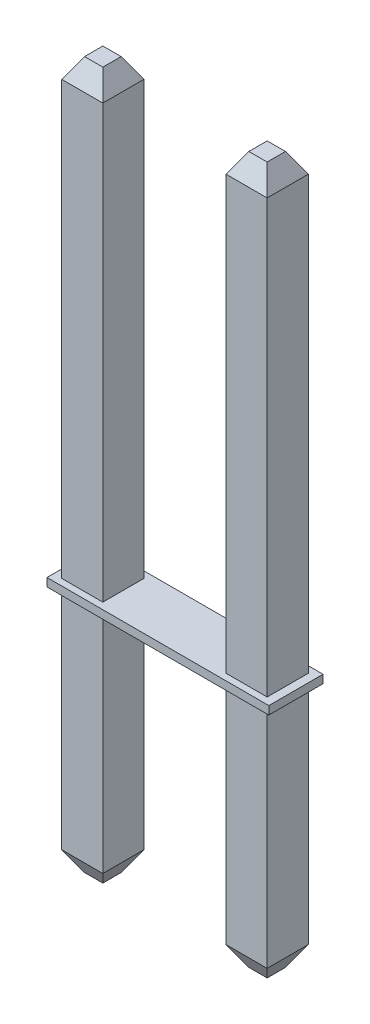
ISO-10303-21;
HEADER;
FILE_DESCRIPTION(('STEP AP214'),'2;1');
FILE_NAME('part.step','',(''),(''),'','','');
FILE_SCHEMA(('AUTOMOTIVE_DESIGN { 1 0 10303 214 1 1 1 1 }'));
ENDSEC;
DATA;
#1=APPLICATION_CONTEXT('core data for automotive mechanical design processes');
#2=APPLICATION_PROTOCOL_DEFINITION('international standard','automotive_design',2000,#1);
#3=PRODUCT_CONTEXT('',#1,'mechanical');
#4=PRODUCT('Part','Part','',(#3));
#5=PRODUCT_RELATED_PRODUCT_CATEGORY('part','',(#4));
#6=PRODUCT_DEFINITION_FORMATION('','',#4);
#7=PRODUCT_DEFINITION_CONTEXT('part definition',#1,'design');
#8=PRODUCT_DEFINITION('design','',#6,#7);
#9=PRODUCT_DEFINITION_SHAPE('','',#8);
#10=(LENGTH_UNIT() NAMED_UNIT(*) SI_UNIT(.MILLI.,.METRE.));
#11=(NAMED_UNIT(*) PLANE_ANGLE_UNIT() SI_UNIT($,.RADIAN.));
#12=(NAMED_UNIT(*) SI_UNIT($,.STERADIAN.) SOLID_ANGLE_UNIT());
#13=UNCERTAINTY_MEASURE_WITH_UNIT(LENGTH_MEASURE(1.E-05),#10,'distance_accuracy_value','');
#14=(GEOMETRIC_REPRESENTATION_CONTEXT(3) GLOBAL_UNCERTAINTY_ASSIGNED_CONTEXT((#13)) GLOBAL_UNIT_ASSIGNED_CONTEXT((#10,
#11,#12)) REPRESENTATION_CONTEXT('',''));
#15=CARTESIAN_POINT('',(0.,0.,0.));
#16=DIRECTION('',(0.,0.,1.));
#17=DIRECTION('',(1.,0.,0.));
#18=AXIS2_PLACEMENT_3D('',#15,#16,#17);
#19=CARTESIAN_POINT('',(5.08,0.3048,-0.3175));
#20=DIRECTION('',(0.,-0.50000000000019,-0.866025403784329));
#21=DIRECTION('',(0.,0.866025403784329,-0.50000000000019));
#22=AXIS2_PLACEMENT_3D('',#19,#20,#21);
#23=PLANE('',#22);
#24=DIRECTION('',(1.,0.,0.));
#25=VECTOR('',#24,1.);
#26=CARTESIAN_POINT('',(0.,0.3048,-0.3175));
#27=LINE('',#26,#25);
#28=CARTESIAN_POINT('',(-1.58750000000001,0.304799999999995,-0.3175));
#29=VERTEX_POINT('',#28);
#30=CARTESIAN_POINT('',(-0.9525,0.3048,-0.3175));
#31=VERTEX_POINT('',#30);
#32=EDGE_CURVE('E227',#29,#31,#27,.T.);
#33=ORIENTED_EDGE('',*,*,#32,.T.);
#34=DIRECTION('',(0.447213595500127,0.774596669241384,-0.447213595499961));
#35=VECTOR('',#34,1.);
#36=CARTESIAN_POINT('',(-1.12847636204907,0.,-0.141523637951));
#37=LINE('',#36,#35);
#38=CARTESIAN_POINT('',(-1.12847636204902,0.,-0.141523637950984));
#39=VERTEX_POINT('',#38);
#40=EDGE_CURVE('E206',#39,#31,#37,.T.);
#41=ORIENTED_EDGE('',*,*,#40,.F.);
#42=DIRECTION('',(1.,0.,0.));
#43=VECTOR('',#42,1.);
#44=CARTESIAN_POINT('',(-1.5875,0.,-0.141523637951));
#45=LINE('',#44,#43);
#46=CARTESIAN_POINT('',(-1.411523637951,0.,-0.141523637950967));
#47=VERTEX_POINT('',#46);
#48=EDGE_CURVE('E200',#39,#47,#45,.F.);
#49=ORIENTED_EDGE('',*,*,#48,.T.);
#50=DIRECTION('',(0.447213595500127,-0.774596669241384,0.447213595499962));
#51=VECTOR('',#50,1.);
#52=CARTESIAN_POINT('',(-1.58750000000007,0.304799999999962,-0.3175));
#53=LINE('',#52,#51);
#54=EDGE_CURVE('E20',#29,#47,#53,.T.);
#55=ORIENTED_EDGE('',*,*,#54,.F.);
#56=EDGE_LOOP('',(#33,#41,#49,#55));
#57=FACE_BOUND('',#56,.T.);
#58=ADVANCED_FACE('F17',(#57),#23,.T.);
#59=CARTESIAN_POINT('',(5.08,0.,0.141523637951));
#60=DIRECTION('',(0.,-0.50000000000019,0.866025403784329));
#61=DIRECTION('',(0.,-0.866025403784329,-0.50000000000019));
#62=AXIS2_PLACEMENT_3D('',#59,#60,#61);
#63=PLANE('',#62);
#64=DIRECTION('',(1.,0.,0.));
#65=VECTOR('',#64,1.);
#66=CARTESIAN_POINT('',(0.,0.3048,0.3175));
#67=LINE('',#66,#65);
#68=CARTESIAN_POINT('',(0.952499999999984,0.304799999999972,0.317500000000033));
#69=VERTEX_POINT('',#68);
#70=CARTESIAN_POINT('',(1.5875,0.304799999999981,0.317500000000033));
#71=VERTEX_POINT('',#70);
#72=EDGE_CURVE('E229',#69,#71,#67,.T.);
#73=ORIENTED_EDGE('',*,*,#72,.F.);
#74=DIRECTION('',(-0.447213595500127,0.774596669241384,0.447213595499961));
#75=VECTOR('',#74,1.);
#76=CARTESIAN_POINT('',(1.128476362049,0.,0.141523637951));
#77=LINE('',#76,#75);
#78=CARTESIAN_POINT('',(1.128476362049,0.,0.141523637951));
#79=VERTEX_POINT('',#78);
#80=EDGE_CURVE('E244',#79,#69,#77,.T.);
#81=ORIENTED_EDGE('',*,*,#80,.F.);
#82=DIRECTION('',(1.,0.,0.));
#83=VECTOR('',#82,1.);
#84=CARTESIAN_POINT('',(-1.5875,0.,0.141523637951));
#85=LINE('',#84,#83);
#86=CARTESIAN_POINT('',(1.41152363795098,0.,0.141523637951));
#87=VERTEX_POINT('',#86);
#88=EDGE_CURVE('E237',#79,#87,#85,.T.);
#89=ORIENTED_EDGE('',*,*,#88,.T.);
#90=DIRECTION('',(-0.447213595500127,-0.774596669241384,-0.447213595499961));
#91=VECTOR('',#90,1.);
#92=CARTESIAN_POINT('',(1.5875,0.3048,0.3175));
#93=LINE('',#92,#91);
#94=EDGE_CURVE('E234',#71,#87,#93,.T.);
#95=ORIENTED_EDGE('',*,*,#94,.F.);
#96=EDGE_LOOP('',(#73,#81,#89,#95));
#97=FACE_BOUND('',#96,.T.);
#98=ADVANCED_FACE('F836',(#97),#63,.T.);
#99=CARTESIAN_POINT('',(-1.411523637951,0.,2.4892));
#100=DIRECTION('',(-0.866025403784329,-0.50000000000019,0.));
#101=DIRECTION('',(0.50000000000019,-0.866025403784329,0.));
#102=AXIS2_PLACEMENT_3D('',#99,#100,#101);
#103=PLANE('',#102);
#104=DIRECTION('',(0.,0.,-1.));
#105=VECTOR('',#104,1.);
#106=CARTESIAN_POINT('',(-1.5875,0.304800000000001,0.3175));
#107=LINE('',#106,#105);
#108=CARTESIAN_POINT('',(-1.58750000000003,0.304799999999977,0.317500000000008));
#109=VERTEX_POINT('',#108);
#110=EDGE_CURVE('E214',#109,#29,#107,.T.);
#111=ORIENTED_EDGE('',*,*,#110,.T.);
#112=ORIENTED_EDGE('',*,*,#54,.T.);
#113=DIRECTION('',(0.,0.,1.));
#114=VECTOR('',#113,1.);
#115=CARTESIAN_POINT('',(-1.411523637951,0.,0.3175));
#116=LINE('',#115,#114);
#117=CARTESIAN_POINT('',(-1.411523637951,0.,0.141523637951));
#118=VERTEX_POINT('',#117);
#119=EDGE_CURVE('E208',#47,#118,#116,.T.);
#120=ORIENTED_EDGE('',*,*,#119,.T.);
#121=DIRECTION('',(0.44721359549996,-0.774596669241384,-0.447213595500127));
#122=VECTOR('',#121,1.);
#123=CARTESIAN_POINT('',(-1.5875,0.304799999999962,0.317500000000065));
#124=LINE('',#123,#122);
#125=EDGE_CURVE('E253',#109,#118,#124,.T.);
#126=ORIENTED_EDGE('',*,*,#125,.F.);
#127=EDGE_LOOP('',(#111,#112,#120,#126));
#128=FACE_BOUND('',#127,.T.);
#129=ADVANCED_FACE('F211',(#128),#103,.T.);
#130=CARTESIAN_POINT('',(-1.5875,0.,0.3175));
#131=DIRECTION('',(0.,1.,0.));
#132=DIRECTION('',(0.,0.,1.));
#133=AXIS2_PLACEMENT_3D('',#130,#131,#132);
#134=PLANE('',#133);
#135=ORIENTED_EDGE('',*,*,#48,.F.);
#136=DIRECTION('',(0.,0.,1.));
#137=VECTOR('',#136,1.);
#138=CARTESIAN_POINT('',(-1.12847636204907,0.,2.4892));
#139=LINE('',#138,#137);
#140=CARTESIAN_POINT('',(-1.12847636204902,0.,0.141523637951));
#141=VERTEX_POINT('',#140);
#142=EDGE_CURVE('E220',#141,#39,#139,.F.);
#143=ORIENTED_EDGE('',*,*,#142,.F.);
#144=DIRECTION('',(1.,0.,0.));
#145=VECTOR('',#144,1.);
#146=CARTESIAN_POINT('',(5.08,0.,0.141523637951));
#147=LINE('',#146,#145);
#148=EDGE_CURVE('E218',#118,#141,#147,.T.);
#149=ORIENTED_EDGE('',*,*,#148,.F.);
#150=ORIENTED_EDGE('',*,*,#119,.F.);
#151=EDGE_LOOP('',(#135,#143,#149,#150));
#152=FACE_BOUND('',#151,.T.);
#153=ADVANCED_FACE('F216',(#152),#134,.F.);
#154=CARTESIAN_POINT('',(-0.9525,0.3048,2.4892));
#155=DIRECTION('',(0.866025403784329,-0.50000000000019,0.));
#156=DIRECTION('',(0.50000000000019,0.866025403784329,0.));
#157=AXIS2_PLACEMENT_3D('',#154,#155,#156);
#158=PLANE('',#157);
#159=ORIENTED_EDGE('',*,*,#142,.T.);
#160=ORIENTED_EDGE('',*,*,#40,.T.);
#161=DIRECTION('',(0.,0.,-1.));
#162=VECTOR('',#161,1.);
#163=CARTESIAN_POINT('',(-0.9525,0.3048,2.4892));
#164=LINE('',#163,#162);
#165=CARTESIAN_POINT('',(-0.9525,0.304799999999991,0.317500000000017));
#166=VERTEX_POINT('',#165);
#167=EDGE_CURVE('E259',#166,#31,#164,.T.);
#168=ORIENTED_EDGE('',*,*,#167,.F.);
#169=DIRECTION('',(0.44721359549996,0.774596669241384,0.447213595500127));
#170=VECTOR('',#169,1.);
#171=CARTESIAN_POINT('',(-1.128476362049,0.,0.141523637951));
#172=LINE('',#171,#170);
#173=EDGE_CURVE('E256',#141,#166,#172,.T.);
#174=ORIENTED_EDGE('',*,*,#173,.F.);
#175=EDGE_LOOP('',(#159,#160,#168,#174));
#176=FACE_BOUND('',#175,.T.);
#177=ADVANCED_FACE('F812',(#176),#158,.T.);
#178=CARTESIAN_POINT('',(0.,0.,-0.3175));
#179=DIRECTION('',(0.,0.,1.));
#180=DIRECTION('',(1.,0.,0.));
#181=AXIS2_PLACEMENT_3D('',#178,#179,#180);
#182=PLANE('',#181);
#183=DIRECTION('',(0.,1.,0.));
#184=VECTOR('',#183,1.);
#185=CARTESIAN_POINT('',(-1.5875,10.922,-0.3175));
#186=LINE('',#185,#184);
#187=CARTESIAN_POINT('',(-1.5875,3.81,-0.3175));
#188=VERTEX_POINT('',#187);
#189=EDGE_CURVE('E247',#29,#188,#186,.T.);
#190=ORIENTED_EDGE('',*,*,#189,.T.);
#191=DIRECTION('',(1.,0.,0.));
#192=VECTOR('',#191,1.);
#193=CARTESIAN_POINT('',(0.,3.81,-0.3175));
#194=LINE('',#193,#192);
#195=CARTESIAN_POINT('',(-0.9525,3.81,-0.3175));
#196=VERTEX_POINT('',#195);
#197=EDGE_CURVE('E225',#196,#188,#194,.F.);
#198=ORIENTED_EDGE('',*,*,#197,.F.);
#199=DIRECTION('',(0.,1.,0.));
#200=VECTOR('',#199,1.);
#201=CARTESIAN_POINT('',(-0.9525,3.81,-0.3175));
#202=LINE('',#201,#200);
#203=EDGE_CURVE('E262',#31,#196,#202,.T.);
#204=ORIENTED_EDGE('',*,*,#203,.F.);
#205=ORIENTED_EDGE('',*,*,#32,.F.);
#206=EDGE_LOOP('',(#190,#198,#204,#205));
#207=FACE_BOUND('',#206,.T.);
#208=ADVANCED_FACE('F803',(#207),#182,.F.);
#209=CARTESIAN_POINT('',(0.,0.,0.3175));
#210=DIRECTION('',(0.,0.,1.));
#211=DIRECTION('',(1.,0.,0.));
#212=AXIS2_PLACEMENT_3D('',#209,#210,#211);
#213=PLANE('',#212);
#214=DIRECTION('',(0.,1.,0.));
#215=VECTOR('',#214,1.);
#216=CARTESIAN_POINT('',(1.5875,0.,0.3175));
#217=LINE('',#216,#215);
#218=CARTESIAN_POINT('',(1.5875,3.81,0.3175));
#219=VERTEX_POINT('',#218);
#220=EDGE_CURVE('E267',#71,#219,#217,.T.);
#221=ORIENTED_EDGE('',*,*,#220,.T.);
#222=DIRECTION('',(1.,0.,0.));
#223=VECTOR('',#222,1.);
#224=CARTESIAN_POINT('',(0.,3.81,0.3175));
#225=LINE('',#224,#223);
#226=CARTESIAN_POINT('',(0.9525,3.81,0.3175));
#227=VERTEX_POINT('',#226);
#228=EDGE_CURVE('E232',#219,#227,#225,.F.);
#229=ORIENTED_EDGE('',*,*,#228,.T.);
#230=DIRECTION('',(0.,1.,0.));
#231=VECTOR('',#230,1.);
#232=CARTESIAN_POINT('',(0.9525,-7.112,0.3175));
#233=LINE('',#232,#231);
#234=EDGE_CURVE('E278',#69,#227,#233,.T.);
#235=ORIENTED_EDGE('',*,*,#234,.F.);
#236=ORIENTED_EDGE('',*,*,#72,.T.);
#237=EDGE_LOOP('',(#221,#229,#235,#236));
#238=FACE_BOUND('',#237,.T.);
#239=ADVANCED_FACE('F794',(#238),#213,.T.);
#240=CARTESIAN_POINT('',(1.5875,0.3048,2.4892));
#241=DIRECTION('',(0.866025403784329,-0.50000000000019,0.));
#242=DIRECTION('',(0.50000000000019,0.866025403784329,0.));
#243=AXIS2_PLACEMENT_3D('',#240,#241,#242);
#244=PLANE('',#243);
#245=DIRECTION('',(0.,0.,1.));
#246=VECTOR('',#245,1.);
#247=CARTESIAN_POINT('',(1.411523637951,0.,0.3175));
#248=LINE('',#247,#246);
#249=CARTESIAN_POINT('',(1.41152363795097,0.,-0.141523637950984));
#250=VERTEX_POINT('',#249);
#251=EDGE_CURVE('E239',#87,#250,#248,.F.);
#252=ORIENTED_EDGE('',*,*,#251,.T.);
#253=DIRECTION('',(-0.44721359549996,-0.774596669241384,0.447213595500127));
#254=VECTOR('',#253,1.);
#255=CARTESIAN_POINT('',(1.5875,0.3048,-0.3175));
#256=LINE('',#255,#254);
#257=CARTESIAN_POINT('',(1.5875,0.3048,-0.3175));
#258=VERTEX_POINT('',#257);
#259=EDGE_CURVE('E283',#258,#250,#256,.T.);
#260=ORIENTED_EDGE('',*,*,#259,.F.);
#261=DIRECTION('',(0.,0.,1.));
#262=VECTOR('',#261,1.);
#263=CARTESIAN_POINT('',(1.5875,0.3048,0.3175));
#264=LINE('',#263,#262);
#265=EDGE_CURVE('E272',#258,#71,#264,.T.);
#266=ORIENTED_EDGE('',*,*,#265,.T.);
#267=ORIENTED_EDGE('',*,*,#94,.T.);
#268=EDGE_LOOP('',(#252,#260,#266,#267));
#269=FACE_BOUND('',#268,.T.);
#270=ADVANCED_FACE('F785',(#269),#244,.T.);
#271=CARTESIAN_POINT('',(-1.5875,0.,0.3175));
#272=DIRECTION('',(0.,1.,0.));
#273=DIRECTION('',(0.,0.,1.));
#274=AXIS2_PLACEMENT_3D('',#271,#272,#273);
#275=PLANE('',#274);
#276=ORIENTED_EDGE('',*,*,#88,.F.);
#277=DIRECTION('',(0.,0.,1.));
#278=VECTOR('',#277,1.);
#279=CARTESIAN_POINT('',(1.128476362049,0.,2.4892));
#280=LINE('',#279,#278);
#281=CARTESIAN_POINT('',(1.128476362049,0.,-0.141523637950984));
#282=VERTEX_POINT('',#281);
#283=EDGE_CURVE('E241',#282,#79,#280,.T.);
#284=ORIENTED_EDGE('',*,*,#283,.F.);
#285=DIRECTION('',(1.,0.,0.));
#286=VECTOR('',#285,1.);
#287=CARTESIAN_POINT('',(5.08,0.,-0.141523637950935));
#288=LINE('',#287,#286);
#289=EDGE_CURVE('E286',#250,#282,#288,.F.);
#290=ORIENTED_EDGE('',*,*,#289,.F.);
#291=ORIENTED_EDGE('',*,*,#251,.F.);
#292=EDGE_LOOP('',(#276,#284,#290,#291));
#293=FACE_BOUND('',#292,.T.);
#294=ADVANCED_FACE('F776',(#293),#275,.F.);
#295=CARTESIAN_POINT('',(1.128476362049,0.,2.4892));
#296=DIRECTION('',(-0.866025403784329,-0.50000000000019,0.));
#297=DIRECTION('',(0.50000000000019,-0.866025403784329,0.));
#298=AXIS2_PLACEMENT_3D('',#295,#296,#297);
#299=PLANE('',#298);
#300=DIRECTION('',(0.,0.,1.));
#301=VECTOR('',#300,1.);
#302=CARTESIAN_POINT('',(0.9525,0.3048,2.4892));
#303=LINE('',#302,#301);
#304=CARTESIAN_POINT('',(0.952499999999967,0.304799999999981,-0.3175));
#305=VERTEX_POINT('',#304);
#306=EDGE_CURVE('E275',#305,#69,#303,.T.);
#307=ORIENTED_EDGE('',*,*,#306,.F.);
#308=DIRECTION('',(-0.44721359549996,0.774596669241384,-0.447213595500127));
#309=VECTOR('',#308,1.);
#310=CARTESIAN_POINT('',(1.128476362049,0.,-0.141523637950935));
#311=LINE('',#310,#309);
#312=EDGE_CURVE('E289',#282,#305,#311,.T.);
#313=ORIENTED_EDGE('',*,*,#312,.F.);
#314=ORIENTED_EDGE('',*,*,#283,.T.);
#315=ORIENTED_EDGE('',*,*,#80,.T.);
#316=EDGE_LOOP('',(#307,#313,#314,#315));
#317=FACE_BOUND('',#316,.T.);
#318=ADVANCED_FACE('F767',(#317),#299,.T.);
#319=CARTESIAN_POINT('',(-1.5875,10.6172,2.4892));
#320=DIRECTION('',(-0.866025403784329,0.50000000000019,0.));
#321=DIRECTION('',(-0.50000000000019,-0.866025403784329,0.));
#322=AXIS2_PLACEMENT_3D('',#319,#320,#321);
#323=PLANE('',#322);
#324=DIRECTION('',(0.,0.,-1.));
#325=VECTOR('',#324,1.);
#326=CARTESIAN_POINT('',(-1.411523637951,10.922,0.3175));
#327=LINE('',#326,#325);
#328=CARTESIAN_POINT('',(-1.41152363795098,10.922,0.141523637950984));
#329=VERTEX_POINT('',#328);
#330=CARTESIAN_POINT('',(-1.41152363795097,10.922,-0.141523637951));
#331=VERTEX_POINT('',#330);
#332=EDGE_CURVE('E292',#329,#331,#327,.T.);
#333=ORIENTED_EDGE('',*,*,#332,.T.);
#334=DIRECTION('',(0.44721359549996,0.774596669241384,0.447213595500127));
#335=VECTOR('',#334,1.);
#336=CARTESIAN_POINT('',(-1.5875,10.6172,-0.317500000000066));
#337=LINE('',#336,#335);
#338=CARTESIAN_POINT('',(-1.5875,10.6172,-0.317500000000008));
#339=VERTEX_POINT('',#338);
#340=EDGE_CURVE('E294',#339,#331,#337,.T.);
#341=ORIENTED_EDGE('',*,*,#340,.F.);
#342=DIRECTION('',(0.,0.,-1.));
#343=VECTOR('',#342,1.);
#344=CARTESIAN_POINT('',(-1.5875,10.6172,0.3175));
#345=LINE('',#344,#343);
#346=CARTESIAN_POINT('',(-1.5875,10.6172,0.3175));
#347=VERTEX_POINT('',#346);
#348=EDGE_CURVE('E308',#339,#347,#345,.F.);
#349=ORIENTED_EDGE('',*,*,#348,.T.);
#350=DIRECTION('',(-0.44721359549996,-0.774596669241384,0.447213595500127));
#351=VECTOR('',#350,1.);
#352=CARTESIAN_POINT('',(-1.411523637951,10.922,0.141523637950934));
#353=LINE('',#352,#351);
#354=EDGE_CURVE('E303',#329,#347,#353,.T.);
#355=ORIENTED_EDGE('',*,*,#354,.F.);
#356=EDGE_LOOP('',(#333,#341,#349,#355));
#357=FACE_BOUND('',#356,.T.);
#358=ADVANCED_FACE('F758',(#357),#323,.T.);
#359=CARTESIAN_POINT('',(-1.5875,10.922,0.3175));
#360=DIRECTION('',(1.,0.,0.));
#361=DIRECTION('',(0.,0.,-1.));
#362=AXIS2_PLACEMENT_3D('',#359,#360,#361);
#363=PLANE('',#362);
#364=DIRECTION('',(0.,1.,0.));
#365=VECTOR('',#364,1.);
#366=CARTESIAN_POINT('',(-1.5875,0.,0.3175));
#367=LINE('',#366,#365);
#368=CARTESIAN_POINT('',(-1.5875,3.81,0.3175));
#369=VERTEX_POINT('',#368);
#370=EDGE_CURVE('E310',#369,#109,#367,.F.);
#371=ORIENTED_EDGE('',*,*,#370,.F.);
#372=DIRECTION('',(0.,0.,-1.));
#373=VECTOR('',#372,1.);
#374=CARTESIAN_POINT('',(-1.5875,3.81,0.3175));
#375=LINE('',#374,#373);
#376=EDGE_CURVE('E250',#188,#369,#375,.F.);
#377=ORIENTED_EDGE('',*,*,#376,.F.);
#378=ORIENTED_EDGE('',*,*,#189,.F.);
#379=ORIENTED_EDGE('',*,*,#110,.F.);
#380=EDGE_LOOP('',(#371,#377,#378,#379));
#381=FACE_BOUND('',#380,.T.);
#382=ADVANCED_FACE('F749',(#381),#363,.F.);
#383=CARTESIAN_POINT('',(5.08,0.,0.141523637951));
#384=DIRECTION('',(0.,-0.50000000000019,0.866025403784329));
#385=DIRECTION('',(0.,-0.866025403784329,-0.50000000000019));
#386=AXIS2_PLACEMENT_3D('',#383,#384,#385);
#387=PLANE('',#386);
#388=ORIENTED_EDGE('',*,*,#148,.T.);
#389=ORIENTED_EDGE('',*,*,#173,.T.);
#390=DIRECTION('',(1.,0.,0.));
#391=VECTOR('',#390,1.);
#392=CARTESIAN_POINT('',(0.,0.3048,0.3175));
#393=LINE('',#392,#391);
#394=EDGE_CURVE('E313',#109,#166,#393,.T.);
#395=ORIENTED_EDGE('',*,*,#394,.F.);
#396=ORIENTED_EDGE('',*,*,#125,.T.);
#397=EDGE_LOOP('',(#388,#389,#395,#396));
#398=FACE_BOUND('',#397,.T.);
#399=ADVANCED_FACE('F740',(#398),#387,.T.);
#400=CARTESIAN_POINT('',(-0.9525,3.81,2.4892));
#401=DIRECTION('',(1.,0.,0.));
#402=DIRECTION('',(0.,0.,-1.));
#403=AXIS2_PLACEMENT_3D('',#400,#401,#402);
#404=PLANE('',#403);
#405=ORIENTED_EDGE('',*,*,#203,.T.);
#406=DIRECTION('',(0.,0.,-1.));
#407=VECTOR('',#406,1.);
#408=CARTESIAN_POINT('',(-0.9525,3.81,2.4892));
#409=LINE('',#408,#407);
#410=CARTESIAN_POINT('',(-0.9525,3.81,0.3175));
#411=VERTEX_POINT('',#410);
#412=EDGE_CURVE('E265',#196,#411,#409,.F.);
#413=ORIENTED_EDGE('',*,*,#412,.T.);
#414=DIRECTION('',(0.,1.,0.));
#415=VECTOR('',#414,1.);
#416=CARTESIAN_POINT('',(-0.9525,0.,0.3175));
#417=LINE('',#416,#415);
#418=EDGE_CURVE('E316',#166,#411,#417,.T.);
#419=ORIENTED_EDGE('',*,*,#418,.F.);
#420=ORIENTED_EDGE('',*,*,#167,.T.);
#421=EDGE_LOOP('',(#405,#413,#419,#420));
#422=FACE_BOUND('',#421,.T.);
#423=ADVANCED_FACE('F731',(#422),#404,.T.);
#424=CARTESIAN_POINT('',(1.5875,0.,0.3175));
#425=DIRECTION('',(-1.,0.,0.));
#426=DIRECTION('',(0.,0.,1.));
#427=AXIS2_PLACEMENT_3D('',#424,#425,#426);
#428=PLANE('',#427);
#429=DIRECTION('',(0.,1.,0.));
#430=VECTOR('',#429,1.);
#431=CARTESIAN_POINT('',(1.5875,0.,-0.3175));
#432=LINE('',#431,#430);
#433=CARTESIAN_POINT('',(1.5875,3.81,-0.3175));
#434=VERTEX_POINT('',#433);
#435=EDGE_CURVE('E319',#258,#434,#432,.T.);
#436=ORIENTED_EDGE('',*,*,#435,.T.);
#437=DIRECTION('',(0.,0.,1.));
#438=VECTOR('',#437,1.);
#439=CARTESIAN_POINT('',(1.5875,3.81,0.3175));
#440=LINE('',#439,#438);
#441=EDGE_CURVE('E270',#219,#434,#440,.F.);
#442=ORIENTED_EDGE('',*,*,#441,.F.);
#443=ORIENTED_EDGE('',*,*,#220,.F.);
#444=ORIENTED_EDGE('',*,*,#265,.F.);
#445=EDGE_LOOP('',(#436,#442,#443,#444));
#446=FACE_BOUND('',#445,.T.);
#447=ADVANCED_FACE('F722',(#446),#428,.F.);
#448=CARTESIAN_POINT('',(0.9525,-7.112,2.4892));
#449=DIRECTION('',(-1.,0.,0.));
#450=DIRECTION('',(0.,0.,1.));
#451=AXIS2_PLACEMENT_3D('',#448,#449,#450);
#452=PLANE('',#451);
#453=ORIENTED_EDGE('',*,*,#234,.T.);
#454=DIRECTION('',(0.,0.,1.));
#455=VECTOR('',#454,1.);
#456=CARTESIAN_POINT('',(0.9525,3.81,2.4892));
#457=LINE('',#456,#455);
#458=CARTESIAN_POINT('',(0.9525,3.81,-0.3175));
#459=VERTEX_POINT('',#458);
#460=EDGE_CURVE('E281',#227,#459,#457,.F.);
#461=ORIENTED_EDGE('',*,*,#460,.T.);
#462=DIRECTION('',(0.,1.,0.));
#463=VECTOR('',#462,1.);
#464=CARTESIAN_POINT('',(0.9525,0.,-0.3175));
#465=LINE('',#464,#463);
#466=EDGE_CURVE('E322',#459,#305,#465,.F.);
#467=ORIENTED_EDGE('',*,*,#466,.T.);
#468=ORIENTED_EDGE('',*,*,#306,.T.);
#469=EDGE_LOOP('',(#453,#461,#467,#468));
#470=FACE_BOUND('',#469,.T.);
#471=ADVANCED_FACE('F713',(#470),#452,.T.);
#472=CARTESIAN_POINT('',(5.08,0.3048,-0.3175));
#473=DIRECTION('',(0.,-0.50000000000019,-0.866025403784329));
#474=DIRECTION('',(0.,0.866025403784329,-0.50000000000019));
#475=AXIS2_PLACEMENT_3D('',#472,#473,#474);
#476=PLANE('',#475);
#477=ORIENTED_EDGE('',*,*,#289,.T.);
#478=ORIENTED_EDGE('',*,*,#312,.T.);
#479=DIRECTION('',(1.,0.,0.));
#480=VECTOR('',#479,1.);
#481=CARTESIAN_POINT('',(0.,0.3048,-0.3175));
#482=LINE('',#481,#480);
#483=EDGE_CURVE('E325',#305,#258,#482,.T.);
#484=ORIENTED_EDGE('',*,*,#483,.T.);
#485=ORIENTED_EDGE('',*,*,#259,.T.);
#486=EDGE_LOOP('',(#477,#478,#484,#485));
#487=FACE_BOUND('',#486,.T.);
#488=ADVANCED_FACE('F704',(#487),#476,.T.);
#489=CARTESIAN_POINT('',(1.5875,10.922,0.3175));
#490=DIRECTION('',(0.,-1.,0.));
#491=DIRECTION('',(0.,0.,-1.));
#492=AXIS2_PLACEMENT_3D('',#489,#490,#491);
#493=PLANE('',#492);
#494=DIRECTION('',(0.,0.,1.));
#495=VECTOR('',#494,1.);
#496=CARTESIAN_POINT('',(-1.128476362049,10.922,2.4892));
#497=LINE('',#496,#495);
#498=CARTESIAN_POINT('',(-1.128476362049,10.922,-0.141523637951));
#499=VERTEX_POINT('',#498);
#500=CARTESIAN_POINT('',(-1.128476362049,10.922,0.141523637950984));
#501=VERTEX_POINT('',#500);
#502=EDGE_CURVE('E336',#499,#501,#497,.T.);
#503=ORIENTED_EDGE('',*,*,#502,.F.);
#504=DIRECTION('',(1.,0.,0.));
#505=VECTOR('',#504,1.);
#506=CARTESIAN_POINT('',(5.08,10.922,-0.141523637951));
#507=LINE('',#506,#505);
#508=EDGE_CURVE('E297',#331,#499,#507,.T.);
#509=ORIENTED_EDGE('',*,*,#508,.F.);
#510=ORIENTED_EDGE('',*,*,#332,.F.);
#511=DIRECTION('',(1.,0.,0.));
#512=VECTOR('',#511,1.);
#513=CARTESIAN_POINT('',(5.08,10.922,0.141523637950934));
#514=LINE('',#513,#512);
#515=EDGE_CURVE('E300',#501,#329,#514,.F.);
#516=ORIENTED_EDGE('',*,*,#515,.F.);
#517=EDGE_LOOP('',(#503,#509,#510,#516));
#518=FACE_BOUND('',#517,.T.);
#519=ADVANCED_FACE('F695',(#518),#493,.F.);
#520=CARTESIAN_POINT('',(5.08,10.922,-0.141523637951));
#521=DIRECTION('',(0.,0.50000000000019,-0.866025403784329));
#522=DIRECTION('',(0.,0.866025403784329,0.50000000000019));
#523=AXIS2_PLACEMENT_3D('',#520,#521,#522);
#524=PLANE('',#523);
#525=ORIENTED_EDGE('',*,*,#508,.T.);
#526=DIRECTION('',(-0.447213595500127,0.774596669241384,0.447213595499961));
#527=VECTOR('',#526,1.);
#528=CARTESIAN_POINT('',(-0.952499999999934,10.6172,-0.3175));
#529=LINE('',#528,#527);
#530=CARTESIAN_POINT('',(-0.952499999999992,10.6172,-0.317500000000033));
#531=VERTEX_POINT('',#530);
#532=EDGE_CURVE('E342',#531,#499,#529,.T.);
#533=ORIENTED_EDGE('',*,*,#532,.F.);
#534=DIRECTION('',(1.,0.,0.));
#535=VECTOR('',#534,1.);
#536=CARTESIAN_POINT('',(0.,10.6172,-0.3175));
#537=LINE('',#536,#535);
#538=EDGE_CURVE('E333',#531,#339,#537,.F.);
#539=ORIENTED_EDGE('',*,*,#538,.T.);
#540=ORIENTED_EDGE('',*,*,#340,.T.);
#541=EDGE_LOOP('',(#525,#533,#539,#540));
#542=FACE_BOUND('',#541,.T.);
#543=ADVANCED_FACE('F686',(#542),#524,.T.);
#544=CARTESIAN_POINT('',(5.08,10.6172,0.3175));
#545=DIRECTION('',(0.,0.50000000000019,0.866025403784329));
#546=DIRECTION('',(0.,-0.866025403784329,0.50000000000019));
#547=AXIS2_PLACEMENT_3D('',#544,#545,#546);
#548=PLANE('',#547);
#549=DIRECTION('',(1.,0.,0.));
#550=VECTOR('',#549,1.);
#551=CARTESIAN_POINT('',(0.,10.6172,0.3175));
#552=LINE('',#551,#550);
#553=CARTESIAN_POINT('',(-0.952499999999984,10.6172,0.3175));
#554=VERTEX_POINT('',#553);
#555=EDGE_CURVE('E345',#554,#347,#552,.F.);
#556=ORIENTED_EDGE('',*,*,#555,.F.);
#557=DIRECTION('',(0.447213595500127,-0.774596669241384,0.447213595499961));
#558=VECTOR('',#557,1.);
#559=CARTESIAN_POINT('',(-1.128476362049,10.922,0.141523637951));
#560=LINE('',#559,#558);
#561=EDGE_CURVE('E339',#501,#554,#560,.T.);
#562=ORIENTED_EDGE('',*,*,#561,.F.);
#563=ORIENTED_EDGE('',*,*,#515,.T.);
#564=ORIENTED_EDGE('',*,*,#354,.T.);
#565=EDGE_LOOP('',(#556,#562,#563,#564));
#566=FACE_BOUND('',#565,.T.);
#567=ADVANCED_FACE('F677',(#566),#548,.T.);
#568=CARTESIAN_POINT('',(-1.5875,10.922,0.3175));
#569=DIRECTION('',(1.,0.,0.));
#570=DIRECTION('',(0.,0.,-1.));
#571=AXIS2_PLACEMENT_3D('',#568,#569,#570);
#572=PLANE('',#571);
#573=DIRECTION('',(0.,1.,0.));
#574=VECTOR('',#573,1.);
#575=CARTESIAN_POINT('',(-1.5875,0.,-0.3175));
#576=LINE('',#575,#574);
#577=CARTESIAN_POINT('',(-1.5875,3.937,-0.3175));
#578=VERTEX_POINT('',#577);
#579=EDGE_CURVE('E328',#339,#578,#576,.F.);
#580=ORIENTED_EDGE('',*,*,#579,.T.);
#581=DIRECTION('',(0.,0.,-1.));
#582=VECTOR('',#581,1.);
#583=CARTESIAN_POINT('',(-1.5875,3.937,0.3175));
#584=LINE('',#583,#582);
#585=CARTESIAN_POINT('',(-1.5875,3.937,0.3175));
#586=VERTEX_POINT('',#585);
#587=EDGE_CURVE('E306',#586,#578,#584,.T.);
#588=ORIENTED_EDGE('',*,*,#587,.F.);
#589=DIRECTION('',(0.,1.,0.));
#590=VECTOR('',#589,1.);
#591=CARTESIAN_POINT('',(-1.5875,0.,0.3175));
#592=LINE('',#591,#590);
#593=EDGE_CURVE('E348',#347,#586,#592,.F.);
#594=ORIENTED_EDGE('',*,*,#593,.F.);
#595=ORIENTED_EDGE('',*,*,#348,.F.);
#596=EDGE_LOOP('',(#580,#588,#594,#595));
#597=FACE_BOUND('',#596,.T.);
#598=ADVANCED_FACE('F668',(#597),#572,.F.);
#599=CARTESIAN_POINT('',(0.,0.,0.3175));
#600=DIRECTION('',(0.,0.,1.));
#601=DIRECTION('',(1.,0.,0.));
#602=AXIS2_PLACEMENT_3D('',#599,#600,#601);
#603=PLANE('',#602);
#604=ORIENTED_EDGE('',*,*,#418,.T.);
#605=DIRECTION('',(1.,0.,0.));
#606=VECTOR('',#605,1.);
#607=CARTESIAN_POINT('',(1.7145,3.81,0.3175));
#608=LINE('',#607,#606);
#609=EDGE_CURVE('E353',#411,#369,#608,.F.);
#610=ORIENTED_EDGE('',*,*,#609,.T.);
#611=ORIENTED_EDGE('',*,*,#370,.T.);
#612=ORIENTED_EDGE('',*,*,#394,.T.);
#613=EDGE_LOOP('',(#604,#610,#611,#612));
#614=FACE_BOUND('',#613,.T.);
#615=ADVANCED_FACE('F659',(#614),#603,.T.);
#616=CARTESIAN_POINT('',(0.,0.,-0.3175));
#617=DIRECTION('',(0.,0.,1.));
#618=DIRECTION('',(1.,0.,0.));
#619=AXIS2_PLACEMENT_3D('',#616,#617,#618);
#620=PLANE('',#619);
#621=ORIENTED_EDGE('',*,*,#466,.F.);
#622=DIRECTION('',(1.,0.,0.));
#623=VECTOR('',#622,1.);
#624=CARTESIAN_POINT('',(1.7145,3.81,-0.3175));
#625=LINE('',#624,#623);
#626=EDGE_CURVE('E356',#459,#434,#625,.T.);
#627=ORIENTED_EDGE('',*,*,#626,.T.);
#628=ORIENTED_EDGE('',*,*,#435,.F.);
#629=ORIENTED_EDGE('',*,*,#483,.F.);
#630=EDGE_LOOP('',(#621,#627,#628,#629));
#631=FACE_BOUND('',#630,.T.);
#632=ADVANCED_FACE('F651',(#631),#620,.F.);
#633=CARTESIAN_POINT('',(1.411523637951,10.922,2.4892));
#634=DIRECTION('',(0.866025403784329,0.50000000000019,0.));
#635=DIRECTION('',(-0.50000000000019,0.866025403784329,0.));
#636=AXIS2_PLACEMENT_3D('',#633,#634,#635);
#637=PLANE('',#636);
#638=DIRECTION('',(0.,0.,1.));
#639=VECTOR('',#638,1.);
#640=CARTESIAN_POINT('',(1.5875,10.6172,0.3175));
#641=LINE('',#640,#639);
#642=CARTESIAN_POINT('',(1.58750000000003,10.6172,0.3175));
#643=VERTEX_POINT('',#642);
#644=CARTESIAN_POINT('',(1.58750000000003,10.6172,-0.317500000000008));
#645=VERTEX_POINT('',#644);
#646=EDGE_CURVE('E368',#643,#645,#641,.F.);
#647=ORIENTED_EDGE('',*,*,#646,.T.);
#648=DIRECTION('',(0.44721359549996,-0.774596669241384,-0.447213595500127));
#649=VECTOR('',#648,1.);
#650=CARTESIAN_POINT('',(1.411523637951,10.922,-0.141523637951));
#651=LINE('',#650,#649);
#652=CARTESIAN_POINT('',(1.411523637951,10.922,-0.141523637951));
#653=VERTEX_POINT('',#652);
#654=EDGE_CURVE('E373',#653,#645,#651,.T.);
#655=ORIENTED_EDGE('',*,*,#654,.F.);
#656=DIRECTION('',(0.,0.,-1.));
#657=VECTOR('',#656,1.);
#658=CARTESIAN_POINT('',(1.411523637951,10.922,0.3175));
#659=LINE('',#658,#657);
#660=CARTESIAN_POINT('',(1.411523637951,10.922,0.141523637950984));
#661=VERTEX_POINT('',#660);
#662=EDGE_CURVE('E362',#653,#661,#659,.F.);
#663=ORIENTED_EDGE('',*,*,#662,.T.);
#664=DIRECTION('',(-0.44721359549996,0.774596669241384,-0.447213595500127));
#665=VECTOR('',#664,1.);
#666=CARTESIAN_POINT('',(1.5875,10.6172,0.3175));
#667=LINE('',#666,#665);
#668=EDGE_CURVE('E359',#643,#661,#667,.T.);
#669=ORIENTED_EDGE('',*,*,#668,.F.);
#670=EDGE_LOOP('',(#647,#655,#663,#669));
#671=FACE_BOUND('',#670,.T.);
#672=ADVANCED_FACE('F464',(#671),#637,.T.);
#673=CARTESIAN_POINT('',(0.,0.,-0.3175));
#674=DIRECTION('',(0.,0.,1.));
#675=DIRECTION('',(1.,0.,0.));
#676=AXIS2_PLACEMENT_3D('',#673,#674,#675);
#677=PLANE('',#676);
#678=DIRECTION('',(0.,1.,0.));
#679=VECTOR('',#678,1.);
#680=CARTESIAN_POINT('',(-0.9525,14.859,-0.3175));
#681=LINE('',#680,#679);
#682=CARTESIAN_POINT('',(-0.9525,3.937,-0.3175));
#683=VERTEX_POINT('',#682);
#684=EDGE_CURVE('E376',#683,#531,#681,.T.);
#685=ORIENTED_EDGE('',*,*,#684,.F.);
#686=DIRECTION('',(1.,0.,0.));
#687=VECTOR('',#686,1.);
#688=CARTESIAN_POINT('',(0.,3.937,-0.3175));
#689=LINE('',#688,#687);
#690=EDGE_CURVE('E331',#578,#683,#689,.T.);
#691=ORIENTED_EDGE('',*,*,#690,.F.);
#692=ORIENTED_EDGE('',*,*,#579,.F.);
#693=ORIENTED_EDGE('',*,*,#538,.F.);
#694=EDGE_LOOP('',(#685,#691,#692,#693));
#695=FACE_BOUND('',#694,.T.);
#696=ADVANCED_FACE('F634',(#695),#677,.F.);
#697=CARTESIAN_POINT('',(-1.128476362049,10.922,2.4892));
#698=DIRECTION('',(0.866025403784329,0.50000000000019,0.));
#699=DIRECTION('',(-0.50000000000019,0.866025403784329,0.));
#700=AXIS2_PLACEMENT_3D('',#697,#698,#699);
#701=PLANE('',#700);
#702=DIRECTION('',(0.,0.,-1.));
#703=VECTOR('',#702,1.);
#704=CARTESIAN_POINT('',(-0.9525,10.6172,2.4892));
#705=LINE('',#704,#703);
#706=EDGE_CURVE('E379',#531,#554,#705,.F.);
#707=ORIENTED_EDGE('',*,*,#706,.F.);
#708=ORIENTED_EDGE('',*,*,#532,.T.);
#709=ORIENTED_EDGE('',*,*,#502,.T.);
#710=ORIENTED_EDGE('',*,*,#561,.T.);
#711=EDGE_LOOP('',(#707,#708,#709,#710));
#712=FACE_BOUND('',#711,.T.);
#713=ADVANCED_FACE('F625',(#712),#701,.T.);
#714=CARTESIAN_POINT('',(0.,0.,0.3175));
#715=DIRECTION('',(0.,0.,1.));
#716=DIRECTION('',(1.,0.,0.));
#717=AXIS2_PLACEMENT_3D('',#714,#715,#716);
#718=PLANE('',#717);
#719=ORIENTED_EDGE('',*,*,#593,.T.);
#720=DIRECTION('',(1.,0.,0.));
#721=VECTOR('',#720,1.);
#722=CARTESIAN_POINT('',(0.,3.937,0.3175));
#723=LINE('',#722,#721);
#724=CARTESIAN_POINT('',(-0.9525,3.937,0.3175));
#725=VERTEX_POINT('',#724);
#726=EDGE_CURVE('E351',#586,#725,#723,.T.);
#727=ORIENTED_EDGE('',*,*,#726,.T.);
#728=DIRECTION('',(0.,1.,0.));
#729=VECTOR('',#728,1.);
#730=CARTESIAN_POINT('',(-0.9525,14.859,0.3175));
#731=LINE('',#730,#729);
#732=EDGE_CURVE('E382',#554,#725,#731,.F.);
#733=ORIENTED_EDGE('',*,*,#732,.F.);
#734=ORIENTED_EDGE('',*,*,#555,.T.);
#735=EDGE_LOOP('',(#719,#727,#733,#734));
#736=FACE_BOUND('',#735,.T.);
#737=ADVANCED_FACE('F487',(#736),#718,.T.);
#738=CARTESIAN_POINT('',(1.7145,3.81,0.4191));
#739=DIRECTION('',(0.,1.,0.));
#740=DIRECTION('',(0.,0.,1.));
#741=AXIS2_PLACEMENT_3D('',#738,#739,#740);
#742=PLANE('',#741);
#743=DIRECTION('',(1.,0.,0.));
#744=VECTOR('',#743,1.);
#745=CARTESIAN_POINT('',(1.7145,3.81,-0.4191));
#746=LINE('',#745,#744);
#747=CARTESIAN_POINT('',(-1.7145,3.81,-0.4191));
#748=VERTEX_POINT('',#747);
#749=CARTESIAN_POINT('',(1.7145,3.81,-0.4191));
#750=VERTEX_POINT('',#749);
#751=EDGE_CURVE('E398',#748,#750,#746,.T.);
#752=ORIENTED_EDGE('',*,*,#751,.T.);
#753=DIRECTION('',(0.,0.,-1.));
#754=VECTOR('',#753,1.);
#755=CARTESIAN_POINT('',(1.7145,3.81,0.));
#756=LINE('',#755,#754);
#757=CARTESIAN_POINT('',(1.7145,3.81,0.4191));
#758=VERTEX_POINT('',#757);
#759=EDGE_CURVE('E385',#758,#750,#756,.T.);
#760=ORIENTED_EDGE('',*,*,#759,.F.);
#761=DIRECTION('',(-1.,0.,0.));
#762=VECTOR('',#761,1.);
#763=CARTESIAN_POINT('',(1.7145,3.81,0.4191));
#764=LINE('',#763,#762);
#765=CARTESIAN_POINT('',(-1.7145,3.81,0.4191));
#766=VERTEX_POINT('',#765);
#767=EDGE_CURVE('E391',#758,#766,#764,.T.);
#768=ORIENTED_EDGE('',*,*,#767,.T.);
#769=DIRECTION('',(0.,0.,-1.));
#770=VECTOR('',#769,1.);
#771=CARTESIAN_POINT('',(-1.7145,3.81,0.));
#772=LINE('',#771,#770);
#773=EDGE_CURVE('E396',#766,#748,#772,.T.);
#774=ORIENTED_EDGE('',*,*,#773,.T.);
#775=EDGE_LOOP('',(#752,#760,#768,#774));
#776=FACE_BOUND('',#775,.T.);
#777=ORIENTED_EDGE('',*,*,#460,.F.);
#778=ORIENTED_EDGE('',*,*,#228,.F.);
#779=ORIENTED_EDGE('',*,*,#441,.T.);
#780=ORIENTED_EDGE('',*,*,#626,.F.);
#781=EDGE_LOOP('',(#777,#778,#779,#780));
#782=FACE_BOUND('',#781,.T.);
#783=ORIENTED_EDGE('',*,*,#412,.F.);
#784=ORIENTED_EDGE('',*,*,#197,.T.);
#785=ORIENTED_EDGE('',*,*,#376,.T.);
#786=ORIENTED_EDGE('',*,*,#609,.F.);
#787=EDGE_LOOP('',(#783,#784,#785,#786));
#788=FACE_BOUND('',#787,.T.);
#789=ADVANCED_FACE('F479',(#776,#782,#788),#742,.F.);
#790=CARTESIAN_POINT('',(5.08,10.6172,0.3175));
#791=DIRECTION('',(0.,0.50000000000019,0.866025403784329));
#792=DIRECTION('',(0.,-0.866025403784329,0.50000000000019));
#793=AXIS2_PLACEMENT_3D('',#790,#791,#792);
#794=PLANE('',#793);
#795=DIRECTION('',(1.,0.,0.));
#796=VECTOR('',#795,1.);
#797=CARTESIAN_POINT('',(1.5875,10.922,0.141523637951));
#798=LINE('',#797,#796);
#799=CARTESIAN_POINT('',(1.12847636204902,10.922,0.141523637950967));
#800=VERTEX_POINT('',#799);
#801=EDGE_CURVE('E364',#661,#800,#798,.F.);
#802=ORIENTED_EDGE('',*,*,#801,.T.);
#803=DIRECTION('',(0.447213595500127,0.774596669241384,-0.447213595499961));
#804=VECTOR('',#803,1.);
#805=CARTESIAN_POINT('',(0.9525,10.6172,0.3175));
#806=LINE('',#805,#804);
#807=CARTESIAN_POINT('',(0.9525,10.6172,0.3175));
#808=VERTEX_POINT('',#807);
#809=EDGE_CURVE('E411',#808,#800,#806,.T.);
#810=ORIENTED_EDGE('',*,*,#809,.F.);
#811=DIRECTION('',(1.,0.,0.));
#812=VECTOR('',#811,1.);
#813=CARTESIAN_POINT('',(0.,10.6172,0.3175));
#814=LINE('',#813,#812);
#815=EDGE_CURVE('E408',#643,#808,#814,.F.);
#816=ORIENTED_EDGE('',*,*,#815,.F.);
#817=ORIENTED_EDGE('',*,*,#668,.T.);
#818=EDGE_LOOP('',(#802,#810,#816,#817));
#819=FACE_BOUND('',#818,.T.);
#820=ADVANCED_FACE('F477',(#819),#794,.T.);
#821=CARTESIAN_POINT('',(1.5875,10.922,0.3175));
#822=DIRECTION('',(0.,-1.,0.));
#823=DIRECTION('',(0.,0.,-1.));
#824=AXIS2_PLACEMENT_3D('',#821,#822,#823);
#825=PLANE('',#824);
#826=ORIENTED_EDGE('',*,*,#662,.F.);
#827=DIRECTION('',(1.,0.,0.));
#828=VECTOR('',#827,1.);
#829=CARTESIAN_POINT('',(5.08,10.922,-0.141523637951));
#830=LINE('',#829,#828);
#831=CARTESIAN_POINT('',(1.12847636204902,10.922,-0.141523637951));
#832=VERTEX_POINT('',#831);
#833=EDGE_CURVE('E370',#832,#653,#830,.T.);
#834=ORIENTED_EDGE('',*,*,#833,.F.);
#835=DIRECTION('',(0.,0.,1.));
#836=VECTOR('',#835,1.);
#837=CARTESIAN_POINT('',(1.12847636204907,10.922,2.4892));
#838=LINE('',#837,#836);
#839=EDGE_CURVE('E414',#800,#832,#838,.F.);
#840=ORIENTED_EDGE('',*,*,#839,.F.);
#841=ORIENTED_EDGE('',*,*,#801,.F.);
#842=EDGE_LOOP('',(#826,#834,#840,#841));
#843=FACE_BOUND('',#842,.T.);
#844=ADVANCED_FACE('F462',(#843),#825,.F.);
#845=CARTESIAN_POINT('',(1.5875,0.,0.3175));
#846=DIRECTION('',(-1.,0.,0.));
#847=DIRECTION('',(0.,0.,1.));
#848=AXIS2_PLACEMENT_3D('',#845,#846,#847);
#849=PLANE('',#848);
#850=DIRECTION('',(0.,1.,0.));
#851=VECTOR('',#850,1.);
#852=CARTESIAN_POINT('',(1.5875,0.,0.3175));
#853=LINE('',#852,#851);
#854=CARTESIAN_POINT('',(1.5875,3.937,0.3175));
#855=VERTEX_POINT('',#854);
#856=EDGE_CURVE('E405',#855,#643,#853,.T.);
#857=ORIENTED_EDGE('',*,*,#856,.F.);
#858=DIRECTION('',(0.,0.,1.));
#859=VECTOR('',#858,1.);
#860=CARTESIAN_POINT('',(1.5875,3.937,0.3175));
#861=LINE('',#860,#859);
#862=CARTESIAN_POINT('',(1.5875,3.937,-0.3175));
#863=VERTEX_POINT('',#862);
#864=EDGE_CURVE('E366',#863,#855,#861,.T.);
#865=ORIENTED_EDGE('',*,*,#864,.F.);
#866=DIRECTION('',(0.,1.,0.));
#867=VECTOR('',#866,1.);
#868=CARTESIAN_POINT('',(1.5875,0.,-0.3175));
#869=LINE('',#868,#867);
#870=EDGE_CURVE('E420',#863,#645,#869,.T.);
#871=ORIENTED_EDGE('',*,*,#870,.T.);
#872=ORIENTED_EDGE('',*,*,#646,.F.);
#873=EDGE_LOOP('',(#857,#865,#871,#872));
#874=FACE_BOUND('',#873,.T.);
#875=ADVANCED_FACE('F469',(#874),#849,.F.);
#876=CARTESIAN_POINT('',(5.08,10.922,-0.141523637951));
#877=DIRECTION('',(0.,0.50000000000019,-0.866025403784329));
#878=DIRECTION('',(0.,0.866025403784329,0.50000000000019));
#879=AXIS2_PLACEMENT_3D('',#876,#877,#878);
#880=PLANE('',#879);
#881=DIRECTION('',(1.,0.,0.));
#882=VECTOR('',#881,1.);
#883=CARTESIAN_POINT('',(0.,10.6172,-0.3175));
#884=LINE('',#883,#882);
#885=CARTESIAN_POINT('',(0.9525,10.6172,-0.317500000000033));
#886=VERTEX_POINT('',#885);
#887=EDGE_CURVE('E423',#645,#886,#884,.F.);
#888=ORIENTED_EDGE('',*,*,#887,.T.);
#889=DIRECTION('',(-0.447213595500127,-0.774596669241384,-0.447213595499961));
#890=VECTOR('',#889,1.);
#891=CARTESIAN_POINT('',(1.12847636204907,10.922,-0.141523637951));
#892=LINE('',#891,#890);
#893=EDGE_CURVE('E417',#832,#886,#892,.T.);
#894=ORIENTED_EDGE('',*,*,#893,.F.);
#895=ORIENTED_EDGE('',*,*,#833,.T.);
#896=ORIENTED_EDGE('',*,*,#654,.T.);
#897=EDGE_LOOP('',(#888,#894,#895,#896));
#898=FACE_BOUND('',#897,.T.);
#899=ADVANCED_FACE('F455',(#898),#880,.T.);
#900=CARTESIAN_POINT('',(-0.9525,14.859,2.4892));
#901=DIRECTION('',(1.,0.,0.));
#902=DIRECTION('',(0.,0.,-1.));
#903=AXIS2_PLACEMENT_3D('',#900,#901,#902);
#904=PLANE('',#903);
#905=ORIENTED_EDGE('',*,*,#732,.T.);
#906=DIRECTION('',(0.,0.,-1.));
#907=VECTOR('',#906,1.);
#908=CARTESIAN_POINT('',(-0.9525,3.937,-0.4191));
#909=LINE('',#908,#907);
#910=EDGE_CURVE('E425',#725,#683,#909,.T.);
#911=ORIENTED_EDGE('',*,*,#910,.T.);
#912=ORIENTED_EDGE('',*,*,#684,.T.);
#913=ORIENTED_EDGE('',*,*,#706,.T.);
#914=EDGE_LOOP('',(#905,#911,#912,#913));
#915=FACE_BOUND('',#914,.T.);
#916=ADVANCED_FACE('F519',(#915),#904,.T.);
#917=CARTESIAN_POINT('',(1.7145,0.,0.));
#918=DIRECTION('',(1.,0.,0.));
#919=DIRECTION('',(0.,0.,-1.));
#920=AXIS2_PLACEMENT_3D('',#917,#918,#919);
#921=PLANE('',#920);
#922=ORIENTED_EDGE('',*,*,#759,.T.);
#923=DIRECTION('',(0.,1.,0.));
#924=VECTOR('',#923,1.);
#925=CARTESIAN_POINT('',(1.7145,3.81,-0.4191));
#926=LINE('',#925,#924);
#927=CARTESIAN_POINT('',(1.7145,3.937,-0.4191));
#928=VERTEX_POINT('',#927);
#929=EDGE_CURVE('E400',#750,#928,#926,.T.);
#930=ORIENTED_EDGE('',*,*,#929,.T.);
#931=DIRECTION('',(0.,0.,-1.));
#932=VECTOR('',#931,1.);
#933=CARTESIAN_POINT('',(1.7145,3.937,-0.4191));
#934=LINE('',#933,#932);
#935=CARTESIAN_POINT('',(1.7145,3.937,0.4191));
#936=VERTEX_POINT('',#935);
#937=EDGE_CURVE('E432',#928,#936,#934,.F.);
#938=ORIENTED_EDGE('',*,*,#937,.T.);
#939=DIRECTION('',(0.,1.,0.));
#940=VECTOR('',#939,1.);
#941=CARTESIAN_POINT('',(1.7145,3.937,0.4191));
#942=LINE('',#941,#940);
#943=EDGE_CURVE('E388',#936,#758,#942,.F.);
#944=ORIENTED_EDGE('',*,*,#943,.T.);
#945=EDGE_LOOP('',(#922,#930,#938,#944));
#946=FACE_BOUND('',#945,.T.);
#947=ADVANCED_FACE('F515',(#946),#921,.T.);
#948=CARTESIAN_POINT('',(1.7145,3.937,0.4191));
#949=DIRECTION('',(0.,0.,-1.));
#950=DIRECTION('',(-1.,0.,0.));
#951=AXIS2_PLACEMENT_3D('',#948,#949,#950);
#952=PLANE('',#951);
#953=ORIENTED_EDGE('',*,*,#767,.F.);
#954=ORIENTED_EDGE('',*,*,#943,.F.);
#955=DIRECTION('',(1.,0.,0.));
#956=VECTOR('',#955,1.);
#957=CARTESIAN_POINT('',(1.7145,3.937,0.4191));
#958=LINE('',#957,#956);
#959=CARTESIAN_POINT('',(-1.7145,3.937,0.4191));
#960=VERTEX_POINT('',#959);
#961=EDGE_CURVE('E434',#936,#960,#958,.F.);
#962=ORIENTED_EDGE('',*,*,#961,.T.);
#963=DIRECTION('',(0.,1.,0.));
#964=VECTOR('',#963,1.);
#965=CARTESIAN_POINT('',(-1.7145,0.,0.4191));
#966=LINE('',#965,#964);
#967=EDGE_CURVE('E393',#960,#766,#966,.F.);
#968=ORIENTED_EDGE('',*,*,#967,.T.);
#969=EDGE_LOOP('',(#953,#954,#962,#968));
#970=FACE_BOUND('',#969,.T.);
#971=ADVANCED_FACE('F511',(#970),#952,.F.);
#972=CARTESIAN_POINT('',(-1.7145,0.,0.));
#973=DIRECTION('',(1.,0.,0.));
#974=DIRECTION('',(0.,0.,-1.));
#975=AXIS2_PLACEMENT_3D('',#972,#973,#974);
#976=PLANE('',#975);
#977=DIRECTION('',(0.,1.,0.));
#978=VECTOR('',#977,1.);
#979=CARTESIAN_POINT('',(-1.7145,3.81,-0.4191));
#980=LINE('',#979,#978);
#981=CARTESIAN_POINT('',(-1.7145,3.937,-0.4191));
#982=VERTEX_POINT('',#981);
#983=EDGE_CURVE('E402',#982,#748,#980,.F.);
#984=ORIENTED_EDGE('',*,*,#983,.T.);
#985=ORIENTED_EDGE('',*,*,#773,.F.);
#986=ORIENTED_EDGE('',*,*,#967,.F.);
#987=DIRECTION('',(0.,0.,-1.));
#988=VECTOR('',#987,1.);
#989=CARTESIAN_POINT('',(-1.7145,3.937,-0.4191));
#990=LINE('',#989,#988);
#991=EDGE_CURVE('E436',#960,#982,#990,.T.);
#992=ORIENTED_EDGE('',*,*,#991,.T.);
#993=EDGE_LOOP('',(#984,#985,#986,#992));
#994=FACE_BOUND('',#993,.T.);
#995=ADVANCED_FACE('F507',(#994),#976,.F.);
#996=CARTESIAN_POINT('',(1.7145,3.81,-0.4191));
#997=DIRECTION('',(0.,0.,1.));
#998=DIRECTION('',(1.,0.,0.));
#999=AXIS2_PLACEMENT_3D('',#996,#997,#998);
#1000=PLANE('',#999);
#1001=DIRECTION('',(1.,0.,0.));
#1002=VECTOR('',#1001,1.);
#1003=CARTESIAN_POINT('',(1.7145,3.937,-0.4191));
#1004=LINE('',#1003,#1002);
#1005=EDGE_CURVE('E438',#982,#928,#1004,.T.);
#1006=ORIENTED_EDGE('',*,*,#1005,.T.);
#1007=ORIENTED_EDGE('',*,*,#929,.F.);
#1008=ORIENTED_EDGE('',*,*,#751,.F.);
#1009=ORIENTED_EDGE('',*,*,#983,.F.);
#1010=EDGE_LOOP('',(#1006,#1007,#1008,#1009));
#1011=FACE_BOUND('',#1010,.T.);
#1012=ADVANCED_FACE('F504',(#1011),#1000,.F.);
#1013=CARTESIAN_POINT('',(0.,0.,0.3175));
#1014=DIRECTION('',(0.,0.,1.));
#1015=DIRECTION('',(1.,0.,0.));
#1016=AXIS2_PLACEMENT_3D('',#1013,#1014,#1015);
#1017=PLANE('',#1016);
#1018=DIRECTION('',(0.,1.,0.));
#1019=VECTOR('',#1018,1.);
#1020=CARTESIAN_POINT('',(0.9525,3.937,0.3175));
#1021=LINE('',#1020,#1019);
#1022=CARTESIAN_POINT('',(0.9525,3.937,0.3175));
#1023=VERTEX_POINT('',#1022);
#1024=EDGE_CURVE('E441',#1023,#808,#1021,.T.);
#1025=ORIENTED_EDGE('',*,*,#1024,.F.);
#1026=DIRECTION('',(1.,0.,0.));
#1027=VECTOR('',#1026,1.);
#1028=CARTESIAN_POINT('',(1.7145,3.937,0.3175));
#1029=LINE('',#1028,#1027);
#1030=EDGE_CURVE('E429',#1023,#855,#1029,.T.);
#1031=ORIENTED_EDGE('',*,*,#1030,.T.);
#1032=ORIENTED_EDGE('',*,*,#856,.T.);
#1033=ORIENTED_EDGE('',*,*,#815,.T.);
#1034=EDGE_LOOP('',(#1025,#1031,#1032,#1033));
#1035=FACE_BOUND('',#1034,.T.);
#1036=ADVANCED_FACE('F475',(#1035),#1017,.T.);
#1037=CARTESIAN_POINT('',(0.9525,10.6172,2.4892));
#1038=DIRECTION('',(-0.866025403784329,0.50000000000019,0.));
#1039=DIRECTION('',(-0.50000000000019,-0.866025403784329,0.));
#1040=AXIS2_PLACEMENT_3D('',#1037,#1038,#1039);
#1041=PLANE('',#1040);
#1042=ORIENTED_EDGE('',*,*,#839,.T.);
#1043=ORIENTED_EDGE('',*,*,#893,.T.);
#1044=DIRECTION('',(0.,0.,1.));
#1045=VECTOR('',#1044,1.);
#1046=CARTESIAN_POINT('',(0.9525,10.6172,2.4892));
#1047=LINE('',#1046,#1045);
#1048=EDGE_CURVE('E444',#808,#886,#1047,.F.);
#1049=ORIENTED_EDGE('',*,*,#1048,.F.);
#1050=ORIENTED_EDGE('',*,*,#809,.T.);
#1051=EDGE_LOOP('',(#1042,#1043,#1049,#1050));
#1052=FACE_BOUND('',#1051,.T.);
#1053=ADVANCED_FACE('F458',(#1052),#1041,.T.);
#1054=CARTESIAN_POINT('',(0.,0.,-0.3175));
#1055=DIRECTION('',(0.,0.,1.));
#1056=DIRECTION('',(1.,0.,0.));
#1057=AXIS2_PLACEMENT_3D('',#1054,#1055,#1056);
#1058=PLANE('',#1057);
#1059=ORIENTED_EDGE('',*,*,#870,.F.);
#1060=DIRECTION('',(1.,0.,0.));
#1061=VECTOR('',#1060,1.);
#1062=CARTESIAN_POINT('',(1.7145,3.937,-0.3175));
#1063=LINE('',#1062,#1061);
#1064=CARTESIAN_POINT('',(0.9525,3.937,-0.3175));
#1065=VERTEX_POINT('',#1064);
#1066=EDGE_CURVE('E35',#863,#1065,#1063,.F.);
#1067=ORIENTED_EDGE('',*,*,#1066,.T.);
#1068=DIRECTION('',(0.,1.,0.));
#1069=VECTOR('',#1068,1.);
#1070=CARTESIAN_POINT('',(0.9525,3.937,-0.3175));
#1071=LINE('',#1070,#1069);
#1072=EDGE_CURVE('E26',#886,#1065,#1071,.F.);
#1073=ORIENTED_EDGE('',*,*,#1072,.F.);
#1074=ORIENTED_EDGE('',*,*,#887,.F.);
#1075=EDGE_LOOP('',(#1059,#1067,#1073,#1074));
#1076=FACE_BOUND('',#1075,.T.);
#1077=ADVANCED_FACE('F452',(#1076),#1058,.F.);
#1078=CARTESIAN_POINT('',(1.7145,3.937,-0.4191));
#1079=DIRECTION('',(0.,-1.,0.));
#1080=DIRECTION('',(0.,0.,-1.));
#1081=AXIS2_PLACEMENT_3D('',#1078,#1079,#1080);
#1082=PLANE('',#1081);
#1083=ORIENTED_EDGE('',*,*,#991,.F.);
#1084=ORIENTED_EDGE('',*,*,#961,.F.);
#1085=ORIENTED_EDGE('',*,*,#937,.F.);
#1086=ORIENTED_EDGE('',*,*,#1005,.F.);
#1087=EDGE_LOOP('',(#1083,#1084,#1085,#1086));
#1088=FACE_BOUND('',#1087,.T.);
#1089=DIRECTION('',(0.,0.,1.));
#1090=VECTOR('',#1089,1.);
#1091=CARTESIAN_POINT('',(0.9525,3.937,2.4892));
#1092=LINE('',#1091,#1090);
#1093=EDGE_CURVE('E11',#1065,#1023,#1092,.T.);
#1094=ORIENTED_EDGE('',*,*,#1093,.F.);
#1095=ORIENTED_EDGE('',*,*,#1066,.F.);
#1096=ORIENTED_EDGE('',*,*,#864,.T.);
#1097=ORIENTED_EDGE('',*,*,#1030,.F.);
#1098=EDGE_LOOP('',(#1094,#1095,#1096,#1097));
#1099=FACE_BOUND('',#1098,.T.);
#1100=ORIENTED_EDGE('',*,*,#726,.F.);
#1101=ORIENTED_EDGE('',*,*,#587,.T.);
#1102=ORIENTED_EDGE('',*,*,#690,.T.);
#1103=ORIENTED_EDGE('',*,*,#910,.F.);
#1104=EDGE_LOOP('',(#1100,#1101,#1102,#1103));
#1105=FACE_BOUND('',#1104,.T.);
#1106=ADVANCED_FACE('F472',(#1088,#1099,#1105),#1082,.F.);
#1107=CARTESIAN_POINT('',(0.9525,3.937,2.4892));
#1108=DIRECTION('',(-1.,0.,0.));
#1109=DIRECTION('',(0.,0.,1.));
#1110=AXIS2_PLACEMENT_3D('',#1107,#1108,#1109);
#1111=PLANE('',#1110);
#1112=ORIENTED_EDGE('',*,*,#1072,.T.);
#1113=ORIENTED_EDGE('',*,*,#1093,.T.);
#1114=ORIENTED_EDGE('',*,*,#1024,.T.);
#1115=ORIENTED_EDGE('',*,*,#1048,.T.);
#1116=EDGE_LOOP('',(#1112,#1113,#1114,#1115));
#1117=FACE_BOUND('',#1116,.T.);
#1118=ADVANCED_FACE('F449',(#1117),#1111,.T.);
#1119=CLOSED_SHELL('',(#58,#98,#129,#153,#177,#208,#239,#270,#294,#318,#358,#382,#399,#423,#447,
#471,#488,#519,#543,#567,#598,#615,#632,#672,#696,#713,#737,#789,#820,#844,#875,#899,#916,#947,
#971,#995,#1012,#1036,#1053,#1077,#1106,#1118));
#1120=MANIFOLD_SOLID_BREP('B1',#1119);
#1121=ADVANCED_BREP_SHAPE_REPRESENTATION('',(#18,#1120),#14);
#1122=SHAPE_DEFINITION_REPRESENTATION(#9,#1121);
ENDSEC;
END-ISO-10303-21;
